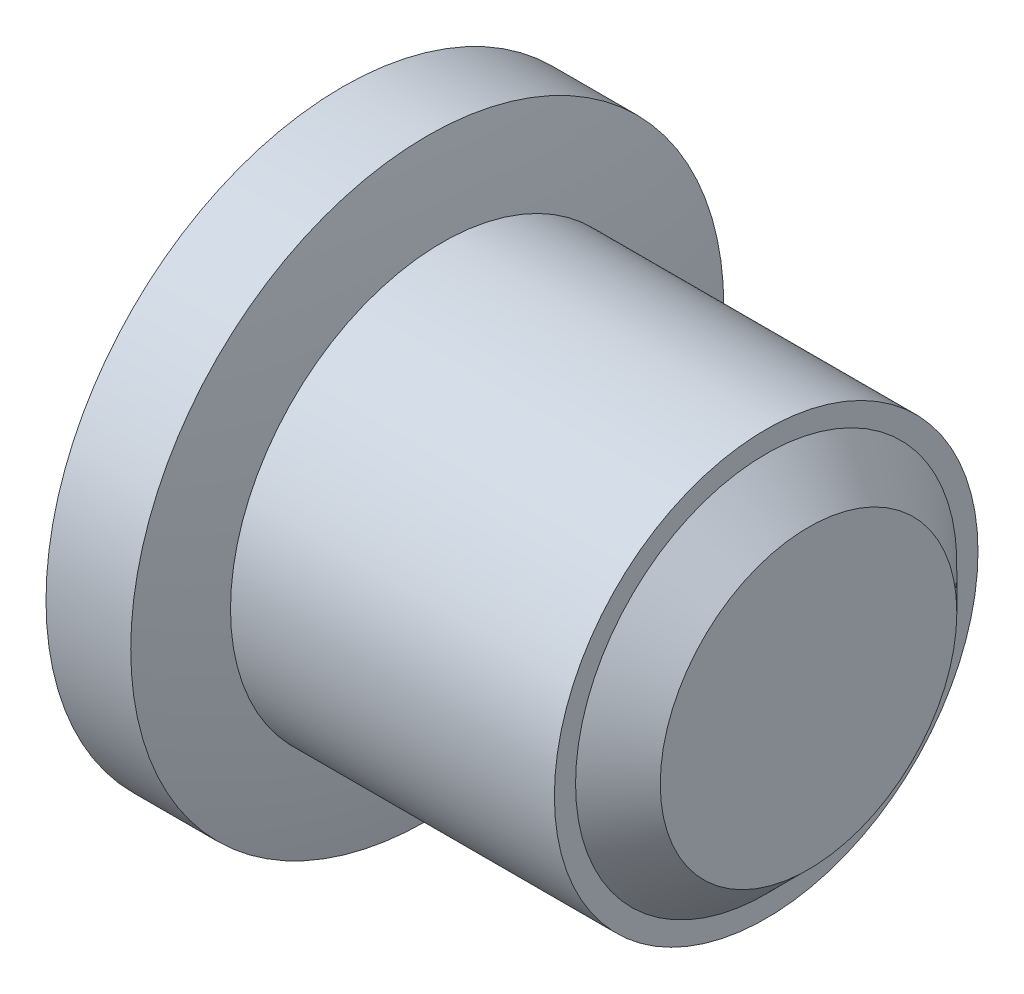
ISO-10303-21;
HEADER;
FILE_DESCRIPTION(('STEP AP214'),'2;1');
FILE_NAME('part.step','',(''),(''),'','','');
FILE_SCHEMA(('AUTOMOTIVE_DESIGN { 1 0 10303 214 1 1 1 1 }'));
ENDSEC;
DATA;
#1=APPLICATION_CONTEXT('core data for automotive mechanical design processes');
#2=APPLICATION_PROTOCOL_DEFINITION('international standard','automotive_design',2000,#1);
#3=PRODUCT_CONTEXT('',#1,'mechanical');
#4=PRODUCT('Part','Part','',(#3));
#5=PRODUCT_RELATED_PRODUCT_CATEGORY('part','',(#4));
#6=PRODUCT_DEFINITION_FORMATION('','',#4);
#7=PRODUCT_DEFINITION_CONTEXT('part definition',#1,'design');
#8=PRODUCT_DEFINITION('design','',#6,#7);
#9=PRODUCT_DEFINITION_SHAPE('','',#8);
#10=(LENGTH_UNIT() NAMED_UNIT(*) SI_UNIT(.MILLI.,.METRE.));
#11=(NAMED_UNIT(*) PLANE_ANGLE_UNIT() SI_UNIT($,.RADIAN.));
#12=(NAMED_UNIT(*) SI_UNIT($,.STERADIAN.) SOLID_ANGLE_UNIT());
#13=UNCERTAINTY_MEASURE_WITH_UNIT(LENGTH_MEASURE(1.E-05),#10,'distance_accuracy_value','');
#14=(GEOMETRIC_REPRESENTATION_CONTEXT(3) GLOBAL_UNCERTAINTY_ASSIGNED_CONTEXT((#13)) GLOBAL_UNIT_ASSIGNED_CONTEXT((#10,
#11,#12)) REPRESENTATION_CONTEXT('',''));
#15=CARTESIAN_POINT('',(0.,0.,0.));
#16=DIRECTION('',(0.,0.,1.));
#17=DIRECTION('',(1.,0.,0.));
#18=AXIS2_PLACEMENT_3D('',#15,#16,#17);
#19=CARTESIAN_POINT('',(-607.86691069983,0.,0.));
#20=DIRECTION('',(-1.,0.,0.));
#21=DIRECTION('',(0.,0.,1.));
#22=AXIS2_PLACEMENT_3D('',#19,#20,#21);
#23=DEGENERATE_TOROIDAL_SURFACE('',#22,45.9345063785837,609.6,.T.);
#24=CARTESIAN_POINT('',(-3.68105705551025,0.,0.));
#25=DIRECTION('',(-1.,0.,0.));
#26=DIRECTION('',(0.,0.,1.));
#27=AXIS2_PLACEMENT_3D('',#24,#25,#26);
#28=CIRCLE('',#27,127.);
#29=CARTESIAN_POINT('',(-3.68105705551025,0.,127.));
#30=VERTEX_POINT('',#29);
#31=EDGE_CURVE('E65',#30,#30,#28,.T.);
#32=ORIENTED_EDGE('',*,*,#31,.T.);
#33=EDGE_LOOP('',(#32));
#34=FACE_BOUND('',#33,.T.);
#35=CARTESIAN_POINT('',(-12.6999999999999,0.,0.));
#36=DIRECTION('',(-1.,0.,0.));
#37=DIRECTION('',(0.,0.,1.));
#38=AXIS2_PLACEMENT_3D('',#35,#36,#37);
#39=CIRCLE('',#38,177.8);
#40=CARTESIAN_POINT('',(-12.6999999999999,0.,177.8));
#41=VERTEX_POINT('',#40);
#42=EDGE_CURVE('E53',#41,#41,#39,.T.);
#43=ORIENTED_EDGE('',*,*,#42,.F.);
#44=EDGE_LOOP('',(#43));
#45=FACE_BOUND('',#44,.T.);
#46=ADVANCED_FACE('F39',(#34,#45),#23,.T.);
#47=CARTESIAN_POINT('',(-63.5,0.,0.));
#48=DIRECTION('',(-1.,0.,0.));
#49=DIRECTION('',(0.,0.,1.));
#50=AXIS2_PLACEMENT_3D('',#47,#48,#49);
#51=CYLINDRICAL_SURFACE('',#50,177.8);
#52=CARTESIAN_POINT('',(-63.4999999999999,0.,0.));
#53=DIRECTION('',(-1.,0.,0.));
#54=DIRECTION('',(0.,0.,1.));
#55=AXIS2_PLACEMENT_3D('',#52,#53,#54);
#56=CIRCLE('',#55,177.8);
#57=CARTESIAN_POINT('',(-63.4999999999999,0.,177.8));
#58=VERTEX_POINT('',#57);
#59=EDGE_CURVE('E59',#58,#58,#56,.T.);
#60=ORIENTED_EDGE('',*,*,#59,.F.);
#61=EDGE_LOOP('',(#60));
#62=FACE_BOUND('',#61,.T.);
#63=ORIENTED_EDGE('',*,*,#42,.T.);
#64=EDGE_LOOP('',(#63));
#65=FACE_BOUND('',#64,.T.);
#66=ADVANCED_FACE('F75',(#62,#65),#51,.T.);
#67=CARTESIAN_POINT('',(-63.5,177.8,0.));
#68=DIRECTION('',(1.,0.,0.));
#69=DIRECTION('',(0.,0.,-1.));
#70=AXIS2_PLACEMENT_3D('',#67,#68,#69);
#71=PLANE('',#70);
#72=ORIENTED_EDGE('',*,*,#59,.T.);
#73=EDGE_LOOP('',(#72));
#74=FACE_BOUND('',#73,.T.);
#75=ADVANCED_FACE('F73',(#74),#71,.F.);
#76=CARTESIAN_POINT('',(190.5,0.,0.));
#77=DIRECTION('',(-1.,0.,0.));
#78=DIRECTION('',(0.,0.,1.));
#79=AXIS2_PLACEMENT_3D('',#76,#77,#78);
#80=CYLINDRICAL_SURFACE('',#79,127.);
#81=CARTESIAN_POINT('',(190.5,0.,0.));
#82=DIRECTION('',(-1.,0.,0.));
#83=DIRECTION('',(0.,0.,1.));
#84=AXIS2_PLACEMENT_3D('',#81,#82,#83);
#85=CIRCLE('',#84,127.);
#86=CARTESIAN_POINT('',(190.5,0.,127.));
#87=VERTEX_POINT('',#86);
#88=EDGE_CURVE('E61',#87,#87,#85,.T.);
#89=ORIENTED_EDGE('',*,*,#88,.T.);
#90=EDGE_LOOP('',(#89));
#91=FACE_BOUND('',#90,.T.);
#92=ORIENTED_EDGE('',*,*,#31,.F.);
#93=EDGE_LOOP('',(#92));
#94=FACE_BOUND('',#93,.T.);
#95=ADVANCED_FACE('F89',(#91,#94),#80,.T.);
#96=CARTESIAN_POINT('',(190.5,0.,0.));
#97=DIRECTION('',(-1.,0.,0.));
#98=DIRECTION('',(0.,0.,1.));
#99=AXIS2_PLACEMENT_3D('',#96,#97,#98);
#100=PLANE('',#99);
#101=CARTESIAN_POINT('',(190.5,0.,0.));
#102=DIRECTION('',(1.,0.,0.));
#103=DIRECTION('',(0.,0.,-1.));
#104=AXIS2_PLACEMENT_3D('',#101,#102,#103);
#105=CIRCLE('',#104,114.3);
#106=CARTESIAN_POINT('',(190.5,0.,114.3));
#107=VERTEX_POINT('',#106);
#108=EDGE_CURVE('E48',#107,#107,#105,.T.);
#109=ORIENTED_EDGE('',*,*,#108,.F.);
#110=EDGE_LOOP('',(#109));
#111=FACE_BOUND('',#110,.T.);
#112=ORIENTED_EDGE('',*,*,#88,.F.);
#113=EDGE_LOOP('',(#112));
#114=FACE_BOUND('',#113,.T.);
#115=ADVANCED_FACE('F92',(#111,#114),#100,.F.);
#116=CARTESIAN_POINT('',(215.9,0.,0.));
#117=DIRECTION('',(1.,0.,0.));
#118=DIRECTION('',(0.,0.,-1.));
#119=AXIS2_PLACEMENT_3D('',#116,#117,#118);
#120=PLANE('',#119);
#121=CARTESIAN_POINT('',(215.9,0.,0.));
#122=DIRECTION('',(1.,0.,0.));
#123=DIRECTION('',(0.,0.,-1.));
#124=AXIS2_PLACEMENT_3D('',#121,#122,#123);
#125=CIRCLE('',#124,88.9);
#126=CARTESIAN_POINT('',(215.9,0.,88.9));
#127=VERTEX_POINT('',#126);
#128=EDGE_CURVE('E10',#127,#127,#125,.T.);
#129=ORIENTED_EDGE('',*,*,#128,.T.);
#130=EDGE_LOOP('',(#129));
#131=FACE_BOUND('',#130,.T.);
#132=ADVANCED_FACE('F96',(#131),#120,.T.);
#133=CARTESIAN_POINT('',(215.9,0.,0.));
#134=DIRECTION('',(-1.,0.,0.));
#135=DIRECTION('',(0.,0.,1.));
#136=AXIS2_PLACEMENT_3D('',#133,#134,#135);
#137=CONICAL_SURFACE('',#136,88.9,0.785398163397448);
#138=CARTESIAN_POINT('',(190.5,0.,114.3));
#139=CARTESIAN_POINT('',(190.764583333333,0.,114.035416666667));
#140=CARTESIAN_POINT('',(191.029166666667,0.,113.770833333333));
#141=CARTESIAN_POINT('',(191.558333333333,0.,113.241666666667));
#142=CARTESIAN_POINT('',(191.822916666667,0.,112.977083333333));
#143=CARTESIAN_POINT('',(192.352083333333,0.,112.447916666667));
#144=CARTESIAN_POINT('',(192.616666666667,0.,112.183333333333));
#145=CARTESIAN_POINT('',(193.145833333333,0.,111.654166666667));
#146=CARTESIAN_POINT('',(193.410416666667,0.,111.389583333333));
#147=CARTESIAN_POINT('',(193.939583333333,0.,110.860416666667));
#148=CARTESIAN_POINT('',(194.204166666667,0.,110.595833333333));
#149=CARTESIAN_POINT('',(194.733333333333,0.,110.066666666667));
#150=CARTESIAN_POINT('',(194.997916666667,0.,109.802083333333));
#151=CARTESIAN_POINT('',(195.527083333333,0.,109.272916666667));
#152=CARTESIAN_POINT('',(195.791666666667,0.,109.008333333333));
#153=CARTESIAN_POINT('',(196.320833333333,0.,108.479166666667));
#154=CARTESIAN_POINT('',(196.585416666667,0.,108.214583333333));
#155=CARTESIAN_POINT('',(197.114583333333,0.,107.685416666667));
#156=CARTESIAN_POINT('',(197.379166666667,0.,107.420833333333));
#157=CARTESIAN_POINT('',(197.908333333333,0.,106.891666666667));
#158=CARTESIAN_POINT('',(198.172916666667,0.,106.627083333333));
#159=CARTESIAN_POINT('',(198.702083333333,0.,106.097916666667));
#160=CARTESIAN_POINT('',(198.966666666667,0.,105.833333333333));
#161=CARTESIAN_POINT('',(199.495833333333,0.,105.304166666667));
#162=CARTESIAN_POINT('',(199.760416666667,0.,105.039583333333));
#163=CARTESIAN_POINT('',(200.289583333333,0.,104.510416666667));
#164=CARTESIAN_POINT('',(200.554166666667,0.,104.245833333333));
#165=CARTESIAN_POINT('',(201.083333333333,0.,103.716666666667));
#166=CARTESIAN_POINT('',(201.347916666667,0.,103.452083333333));
#167=CARTESIAN_POINT('',(201.877083333333,0.,102.922916666667));
#168=CARTESIAN_POINT('',(202.141666666667,0.,102.658333333333));
#169=CARTESIAN_POINT('',(202.670833333333,0.,102.129166666667));
#170=CARTESIAN_POINT('',(202.935416666667,0.,101.864583333333));
#171=CARTESIAN_POINT('',(203.464583333333,0.,101.335416666667));
#172=CARTESIAN_POINT('',(203.729166666667,0.,101.070833333333));
#173=CARTESIAN_POINT('',(204.258333333333,0.,100.541666666667));
#174=CARTESIAN_POINT('',(204.522916666667,0.,100.277083333333));
#175=CARTESIAN_POINT('',(205.052083333333,0.,99.7479166666666));
#176=CARTESIAN_POINT('',(205.316666666667,0.,99.4833333333333));
#177=CARTESIAN_POINT('',(205.845833333333,0.,98.9541666666667));
#178=CARTESIAN_POINT('',(206.110416666667,0.,98.6895833333333));
#179=CARTESIAN_POINT('',(206.639583333333,0.,98.1604166666666));
#180=CARTESIAN_POINT('',(206.904166666667,0.,97.8958333333333));
#181=CARTESIAN_POINT('',(207.433333333333,0.,97.3666666666667));
#182=CARTESIAN_POINT('',(207.697916666667,0.,97.1020833333333));
#183=CARTESIAN_POINT('',(208.227083333333,0.,96.5729166666666));
#184=CARTESIAN_POINT('',(208.491666666667,0.,96.3083333333333));
#185=CARTESIAN_POINT('',(209.020833333333,0.,95.7791666666667));
#186=CARTESIAN_POINT('',(209.285416666667,0.,95.5145833333333));
#187=CARTESIAN_POINT('',(209.814583333333,0.,94.9854166666667));
#188=CARTESIAN_POINT('',(210.079166666667,0.,94.7208333333333));
#189=CARTESIAN_POINT('',(210.608333333333,0.,94.1916666666667));
#190=CARTESIAN_POINT('',(210.872916666667,0.,93.9270833333333));
#191=CARTESIAN_POINT('',(211.402083333333,0.,93.3979166666667));
#192=CARTESIAN_POINT('',(211.666666666667,0.,93.1333333333333));
#193=CARTESIAN_POINT('',(212.195833333333,0.,92.6041666666667));
#194=CARTESIAN_POINT('',(212.460416666667,0.,92.3395833333333));
#195=CARTESIAN_POINT('',(212.989583333333,0.,91.8104166666667));
#196=CARTESIAN_POINT('',(213.254166666667,0.,91.5458333333333));
#197=CARTESIAN_POINT('',(213.783333333333,0.,91.0166666666667));
#198=CARTESIAN_POINT('',(214.047916666667,0.,90.7520833333333));
#199=CARTESIAN_POINT('',(214.577083333333,0.,90.2229166666666));
#200=CARTESIAN_POINT('',(214.841666666667,0.,89.9583333333333));
#201=CARTESIAN_POINT('',(215.370833333333,0.,89.4291666666667));
#202=CARTESIAN_POINT('',(215.635416666667,0.,89.1645833333333));
#203=CARTESIAN_POINT('',(215.9,0.,88.9));
#204=B_SPLINE_CURVE_WITH_KNOTS('',3,(#138,#139,#140,#141,#142,#143,#144,#145,#146,#147,#148,
#149,#150,#151,#152,#153,#154,#155,#156,#157,#158,#159,#160,#161,#162,#163,#164,#165,#166,#167,
#168,#169,#170,#171,#172,#173,#174,#175,#176,#177,#178,#179,#180,#181,#182,#183,#184,#185,#186,
#187,#188,#189,#190,#191,#192,#193,#194,#195,#196,#197,#198,#199,#200,#201,#202,#203),
.UNSPECIFIED.,.F.,.F.,(4,2,2,2,2,2,2,2,2,2,2,2,2,2,2,2,2,2,2,2,2,2,2,2,2,2,2,2,2,2,2,2,4),(0.,
1.12253201513363,2.24506403026729,3.36759604540093,4.49012806053456,5.61266007566821,
6.73519209080187,7.8577241059355,8.98025612106915,10.1027881362028,11.2253201513364,
12.3478521664701,13.4703841816037,14.5929161967374,15.715448211871,16.8379802270046,
17.9605122421383,19.0830442572719,20.2055762724056,21.3281082875392,22.4506403026729,
23.5731723178065,24.6957043329402,25.8182363480738,26.9407683632074,28.0633003783411,
29.1858323934747,30.3083644086084,31.430896423742,32.5534284388757,33.6759604540093,
34.798492469143,35.9210244842766),.UNSPECIFIED.);
#205=EDGE_CURVE('BSEAM42',#107,#127,#204,.T.);
#206=ORIENTED_EDGE('',*,*,#108,.T.);
#207=ORIENTED_EDGE('',*,*,#128,.F.);
#208=ORIENTED_EDGE('',*,*,#205,.T.);
#209=ORIENTED_EDGE('',*,*,#205,.F.);
#210=EDGE_LOOP('',(#206,#208,#207,#209));
#211=FACE_BOUND('',#210,.T.);
#212=ADVANCED_FACE('F42',(#211),#137,.T.);
#213=CLOSED_SHELL('',(#46,#66,#75,#95,#115,#132,#212));
#214=MANIFOLD_SOLID_BREP('B2',#213);
#215=ADVANCED_BREP_SHAPE_REPRESENTATION('',(#18,#214),#14);
#216=SHAPE_DEFINITION_REPRESENTATION(#9,#215);
ENDSEC;
END-ISO-10303-21;
